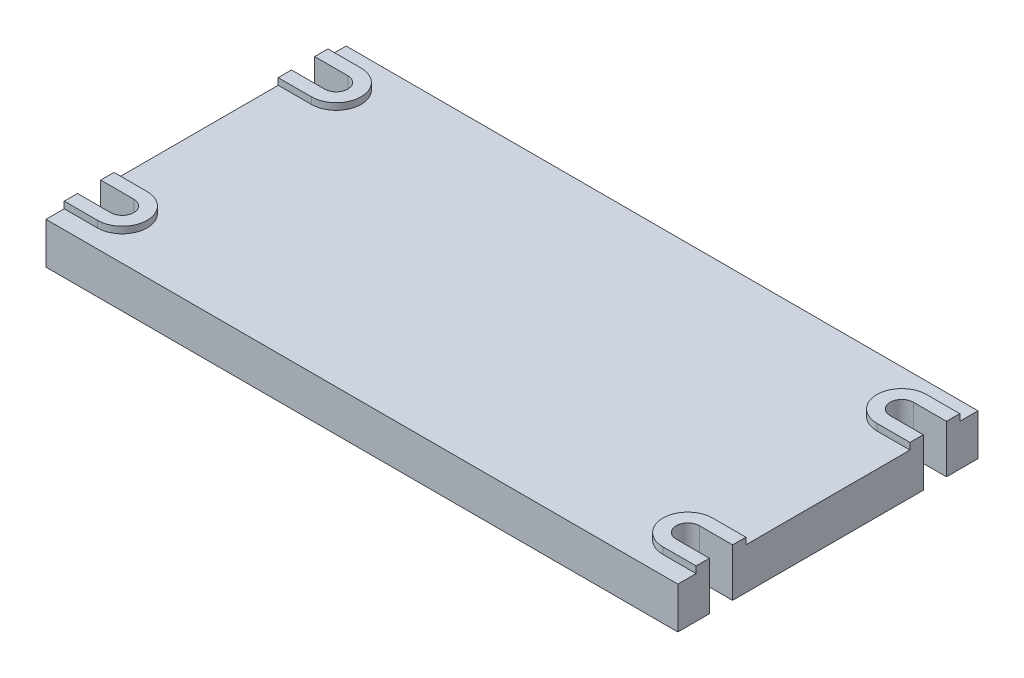
ISO-10303-21;
HEADER;
FILE_DESCRIPTION(('STEP AP214'),'2;1');
FILE_NAME('part.step','',(''),(''),'','','');
FILE_SCHEMA(('AUTOMOTIVE_DESIGN { 1 0 10303 214 1 1 1 1 }'));
ENDSEC;
DATA;
#1=APPLICATION_CONTEXT('core data for automotive mechanical design processes');
#2=APPLICATION_PROTOCOL_DEFINITION('international standard','automotive_design',2000,#1);
#3=PRODUCT_CONTEXT('',#1,'mechanical');
#4=PRODUCT('Part','Part','',(#3));
#5=PRODUCT_RELATED_PRODUCT_CATEGORY('part','',(#4));
#6=PRODUCT_DEFINITION_FORMATION('','',#4);
#7=PRODUCT_DEFINITION_CONTEXT('part definition',#1,'design');
#8=PRODUCT_DEFINITION('design','',#6,#7);
#9=PRODUCT_DEFINITION_SHAPE('','',#8);
#10=(LENGTH_UNIT() NAMED_UNIT(*) SI_UNIT(.MILLI.,.METRE.));
#11=(NAMED_UNIT(*) PLANE_ANGLE_UNIT() SI_UNIT($,.RADIAN.));
#12=(NAMED_UNIT(*) SI_UNIT($,.STERADIAN.) SOLID_ANGLE_UNIT());
#13=UNCERTAINTY_MEASURE_WITH_UNIT(LENGTH_MEASURE(1.E-05),#10,'distance_accuracy_value','');
#14=(GEOMETRIC_REPRESENTATION_CONTEXT(3) GLOBAL_UNCERTAINTY_ASSIGNED_CONTEXT((#13)) GLOBAL_UNIT_ASSIGNED_CONTEXT((#10,
#11,#12)) REPRESENTATION_CONTEXT('',''));
#15=CARTESIAN_POINT('',(0.,0.,0.));
#16=DIRECTION('',(0.,0.,1.));
#17=DIRECTION('',(1.,0.,0.));
#18=AXIS2_PLACEMENT_3D('',#15,#16,#17);
#19=CARTESIAN_POINT('',(190.5,25.,90.5));
#20=DIRECTION('',(-1.,0.,0.));
#21=DIRECTION('',(0.,0.,1.));
#22=AXIS2_PLACEMENT_3D('',#19,#20,#21);
#23=PLANE('',#22);
#24=DIRECTION('',(0.,1.,0.));
#25=VECTOR('',#24,1.);
#26=CARTESIAN_POINT('',(190.5,0.,-71.5));
#27=LINE('',#26,#25);
#28=CARTESIAN_POINT('',(190.5,0.,-71.5));
#29=VERTEX_POINT('',#28);
#30=CARTESIAN_POINT('',(190.5,29.,-71.5));
#31=VERTEX_POINT('',#30);
#32=EDGE_CURVE('E280',#29,#31,#27,.T.);
#33=ORIENTED_EDGE('',*,*,#32,.F.);
#34=DIRECTION('',(0.,0.,-1.));
#35=VECTOR('',#34,1.);
#36=CARTESIAN_POINT('',(190.5,0.,90.5));
#37=LINE('',#36,#35);
#38=CARTESIAN_POINT('',(190.5,0.,-90.5));
#39=VERTEX_POINT('',#38);
#40=EDGE_CURVE('E503',#29,#39,#37,.T.);
#41=ORIENTED_EDGE('',*,*,#40,.T.);
#42=DIRECTION('',(0.,-1.,0.));
#43=VECTOR('',#42,1.);
#44=CARTESIAN_POINT('',(190.5,25.,-90.5));
#45=LINE('',#44,#43);
#46=CARTESIAN_POINT('',(190.5,25.,-90.5));
#47=VERTEX_POINT('',#46);
#48=EDGE_CURVE('E11',#47,#39,#45,.T.);
#49=ORIENTED_EDGE('',*,*,#48,.F.);
#50=DIRECTION('',(0.,0.,-1.));
#51=VECTOR('',#50,1.);
#52=CARTESIAN_POINT('',(190.5,25.,90.5));
#53=LINE('',#52,#51);
#54=CARTESIAN_POINT('',(190.5,25.,-79.5));
#55=VERTEX_POINT('',#54);
#56=EDGE_CURVE('E514',#55,#47,#53,.T.);
#57=ORIENTED_EDGE('',*,*,#56,.F.);
#58=DIRECTION('',(0.,-1.,0.));
#59=VECTOR('',#58,1.);
#60=CARTESIAN_POINT('',(190.5,29.,-79.5));
#61=LINE('',#60,#59);
#62=CARTESIAN_POINT('',(190.5,29.,-79.5));
#63=VERTEX_POINT('',#62);
#64=EDGE_CURVE('E320',#63,#55,#61,.T.);
#65=ORIENTED_EDGE('',*,*,#64,.F.);
#66=DIRECTION('',(0.,0.,1.));
#67=VECTOR('',#66,1.);
#68=CARTESIAN_POINT('',(190.5,29.,0.));
#69=LINE('',#68,#67);
#70=EDGE_CURVE('E289',#63,#31,#69,.T.);
#71=ORIENTED_EDGE('',*,*,#70,.T.);
#72=EDGE_LOOP('',(#33,#41,#49,#57,#65,#71));
#73=FACE_BOUND('',#72,.T.);
#74=ADVANCED_FACE('F34',(#73),#23,.F.);
#75=CARTESIAN_POINT('',(0.,25.,0.));
#76=DIRECTION('',(0.,-1.,0.));
#77=DIRECTION('',(0.,0.,-1.));
#78=AXIS2_PLACEMENT_3D('',#75,#76,#77);
#79=PLANE('',#78);
#80=CARTESIAN_POINT('',(170.5,25.,-64.5));
#81=DIRECTION('',(0.,-1.,0.));
#82=DIRECTION('',(0.,0.,1.));
#83=AXIS2_PLACEMENT_3D('',#80,#81,#82);
#84=CIRCLE('',#83,15.);
#85=CARTESIAN_POINT('',(170.5,25.,-49.5));
#86=VERTEX_POINT('',#85);
#87=CARTESIAN_POINT('',(170.5,25.,-79.5));
#88=VERTEX_POINT('',#87);
#89=EDGE_CURVE('E52',#86,#88,#84,.T.);
#90=ORIENTED_EDGE('',*,*,#89,.T.);
#91=DIRECTION('',(1.,0.,0.));
#92=VECTOR('',#91,1.);
#93=CARTESIAN_POINT('',(0.,25.,-79.5));
#94=LINE('',#93,#92);
#95=EDGE_CURVE('E311',#88,#55,#94,.T.);
#96=ORIENTED_EDGE('',*,*,#95,.T.);
#97=ORIENTED_EDGE('',*,*,#56,.T.);
#98=DIRECTION('',(-1.,0.,0.));
#99=VECTOR('',#98,1.);
#100=CARTESIAN_POINT('',(-190.5,25.,-90.5));
#101=LINE('',#100,#99);
#102=CARTESIAN_POINT('',(-190.5,25.,-90.5));
#103=VERTEX_POINT('',#102);
#104=EDGE_CURVE('E512',#47,#103,#101,.T.);
#105=ORIENTED_EDGE('',*,*,#104,.T.);
#106=DIRECTION('',(0.,0.,1.));
#107=VECTOR('',#106,1.);
#108=CARTESIAN_POINT('',(-190.5,25.,90.5));
#109=LINE('',#108,#107);
#110=CARTESIAN_POINT('',(-190.5,25.,-79.5));
#111=VERTEX_POINT('',#110);
#112=EDGE_CURVE('E524',#103,#111,#109,.T.);
#113=ORIENTED_EDGE('',*,*,#112,.T.);
#114=DIRECTION('',(-1.,0.,0.));
#115=VECTOR('',#114,1.);
#116=CARTESIAN_POINT('',(0.,25.,-79.5));
#117=LINE('',#116,#115);
#118=CARTESIAN_POINT('',(-170.5,25.,-79.5));
#119=VERTEX_POINT('',#118);
#120=EDGE_CURVE('E445',#119,#111,#117,.T.);
#121=ORIENTED_EDGE('',*,*,#120,.F.);
#122=CARTESIAN_POINT('',(-170.5,25.,-64.5));
#123=DIRECTION('',(0.,1.,0.));
#124=DIRECTION('',(0.,0.,1.));
#125=AXIS2_PLACEMENT_3D('',#122,#123,#124);
#126=CIRCLE('',#125,15.);
#127=CARTESIAN_POINT('',(-170.5,25.,-49.5));
#128=VERTEX_POINT('',#127);
#129=EDGE_CURVE('E461',#128,#119,#126,.T.);
#130=ORIENTED_EDGE('',*,*,#129,.F.);
#131=DIRECTION('',(1.,0.,0.));
#132=VECTOR('',#131,1.);
#133=CARTESIAN_POINT('',(0.,25.,-49.5));
#134=LINE('',#133,#132);
#135=CARTESIAN_POINT('',(-190.5,25.,-49.5));
#136=VERTEX_POINT('',#135);
#137=EDGE_CURVE('E435',#136,#128,#134,.T.);
#138=ORIENTED_EDGE('',*,*,#137,.F.);
#139=CARTESIAN_POINT('',(-190.5,25.,49.5));
#140=VERTEX_POINT('',#139);
#141=EDGE_CURVE('E522',#136,#140,#109,.T.);
#142=ORIENTED_EDGE('',*,*,#141,.T.);
#143=DIRECTION('',(1.,0.,0.));
#144=VECTOR('',#143,1.);
#145=CARTESIAN_POINT('',(0.,25.,49.5));
#146=LINE('',#145,#144);
#147=CARTESIAN_POINT('',(-170.5,25.,49.5));
#148=VERTEX_POINT('',#147);
#149=EDGE_CURVE('E389',#140,#148,#146,.T.);
#150=ORIENTED_EDGE('',*,*,#149,.T.);
#151=CARTESIAN_POINT('',(-170.5,25.,64.5));
#152=DIRECTION('',(0.,-1.,0.));
#153=DIRECTION('',(0.,0.,-1.));
#154=AXIS2_PLACEMENT_3D('',#151,#152,#153);
#155=CIRCLE('',#154,15.);
#156=CARTESIAN_POINT('',(-170.5,25.,79.5));
#157=VERTEX_POINT('',#156);
#158=EDGE_CURVE('E410',#148,#157,#155,.T.);
#159=ORIENTED_EDGE('',*,*,#158,.T.);
#160=DIRECTION('',(-1.,0.,0.));
#161=VECTOR('',#160,1.);
#162=CARTESIAN_POINT('',(0.,25.,79.5));
#163=LINE('',#162,#161);
#164=CARTESIAN_POINT('',(-190.5,25.,79.5));
#165=VERTEX_POINT('',#164);
#166=EDGE_CURVE('E379',#157,#165,#163,.T.);
#167=ORIENTED_EDGE('',*,*,#166,.T.);
#168=CARTESIAN_POINT('',(-190.5,25.,90.5));
#169=VERTEX_POINT('',#168);
#170=EDGE_CURVE('E38',#165,#169,#109,.T.);
#171=ORIENTED_EDGE('',*,*,#170,.T.);
#172=DIRECTION('',(1.,0.,0.));
#173=VECTOR('',#172,1.);
#174=CARTESIAN_POINT('',(-190.5,25.,90.5));
#175=LINE('',#174,#173);
#176=CARTESIAN_POINT('',(190.5,25.,90.5));
#177=VERTEX_POINT('',#176);
#178=EDGE_CURVE('E517',#169,#177,#175,.T.);
#179=ORIENTED_EDGE('',*,*,#178,.T.);
#180=CARTESIAN_POINT('',(190.5,25.,79.5));
#181=VERTEX_POINT('',#180);
#182=EDGE_CURVE('E509',#177,#181,#53,.T.);
#183=ORIENTED_EDGE('',*,*,#182,.T.);
#184=DIRECTION('',(1.,0.,0.));
#185=VECTOR('',#184,1.);
#186=CARTESIAN_POINT('',(0.,25.,79.5));
#187=LINE('',#186,#185);
#188=CARTESIAN_POINT('',(170.5,25.,79.5));
#189=VERTEX_POINT('',#188);
#190=EDGE_CURVE('E338',#189,#181,#187,.T.);
#191=ORIENTED_EDGE('',*,*,#190,.F.);
#192=CARTESIAN_POINT('',(170.5,25.,64.5));
#193=DIRECTION('',(0.,1.,0.));
#194=DIRECTION('',(0.,0.,-1.));
#195=AXIS2_PLACEMENT_3D('',#192,#193,#194);
#196=CIRCLE('',#195,15.);
#197=CARTESIAN_POINT('',(170.5,25.,49.5));
#198=VERTEX_POINT('',#197);
#199=EDGE_CURVE('E355',#198,#189,#196,.T.);
#200=ORIENTED_EDGE('',*,*,#199,.F.);
#201=DIRECTION('',(-1.,0.,0.));
#202=VECTOR('',#201,1.);
#203=CARTESIAN_POINT('',(0.,25.,49.5));
#204=LINE('',#203,#202);
#205=CARTESIAN_POINT('',(190.5,25.,49.5));
#206=VERTEX_POINT('',#205);
#207=EDGE_CURVE('E330',#206,#198,#204,.T.);
#208=ORIENTED_EDGE('',*,*,#207,.F.);
#209=CARTESIAN_POINT('',(190.5,25.,-49.5));
#210=VERTEX_POINT('',#209);
#211=EDGE_CURVE('E513',#206,#210,#53,.T.);
#212=ORIENTED_EDGE('',*,*,#211,.T.);
#213=DIRECTION('',(-1.,0.,0.));
#214=VECTOR('',#213,1.);
#215=CARTESIAN_POINT('',(0.,25.,-49.5));
#216=LINE('',#215,#214);
#217=EDGE_CURVE('E57',#210,#86,#216,.T.);
#218=ORIENTED_EDGE('',*,*,#217,.T.);
#219=EDGE_LOOP('',(#90,#96,#97,#105,#113,#121,#130,#138,#142,#150,#159,#167,#171,#179,#183,#191,
#200,#208,#212,#218));
#220=FACE_BOUND('',#219,.T.);
#221=ADVANCED_FACE('F534',(#220),#79,.F.);
#222=CARTESIAN_POINT('',(0.,0.,0.));
#223=DIRECTION('',(0.,-1.,0.));
#224=DIRECTION('',(0.,0.,-1.));
#225=AXIS2_PLACEMENT_3D('',#222,#223,#224);
#226=PLANE('',#225);
#227=DIRECTION('',(1.,0.,0.));
#228=VECTOR('',#227,1.);
#229=CARTESIAN_POINT('',(0.,0.,-57.5));
#230=LINE('',#229,#228);
#231=CARTESIAN_POINT('',(170.5,0.,-57.5));
#232=VERTEX_POINT('',#231);
#233=CARTESIAN_POINT('',(190.5,0.,-57.5));
#234=VERTEX_POINT('',#233);
#235=EDGE_CURVE('E323',#232,#234,#230,.T.);
#236=ORIENTED_EDGE('',*,*,#235,.T.);
#237=CARTESIAN_POINT('',(190.5,0.,57.5));
#238=VERTEX_POINT('',#237);
#239=EDGE_CURVE('E584',#238,#234,#37,.T.);
#240=ORIENTED_EDGE('',*,*,#239,.F.);
#241=DIRECTION('',(1.,0.,0.));
#242=VECTOR('',#241,1.);
#243=CARTESIAN_POINT('',(0.,0.,57.5));
#244=LINE('',#243,#242);
#245=CARTESIAN_POINT('',(170.5,0.,57.5));
#246=VERTEX_POINT('',#245);
#247=EDGE_CURVE('E368',#246,#238,#244,.T.);
#248=ORIENTED_EDGE('',*,*,#247,.F.);
#249=CARTESIAN_POINT('',(170.5,0.,64.5));
#250=DIRECTION('',(0.,1.,0.));
#251=DIRECTION('',(0.,0.,-1.));
#252=AXIS2_PLACEMENT_3D('',#249,#250,#251);
#253=CIRCLE('',#252,7.);
#254=CARTESIAN_POINT('',(170.5,0.,71.5));
#255=VERTEX_POINT('',#254);
#256=EDGE_CURVE('E370',#246,#255,#253,.T.);
#257=ORIENTED_EDGE('',*,*,#256,.T.);
#258=DIRECTION('',(1.,0.,0.));
#259=VECTOR('',#258,1.);
#260=CARTESIAN_POINT('',(0.,0.,71.5));
#261=LINE('',#260,#259);
#262=CARTESIAN_POINT('',(190.5,0.,71.5));
#263=VERTEX_POINT('',#262);
#264=EDGE_CURVE('E373',#255,#263,#261,.T.);
#265=ORIENTED_EDGE('',*,*,#264,.T.);
#266=CARTESIAN_POINT('',(190.5,0.,90.5));
#267=VERTEX_POINT('',#266);
#268=EDGE_CURVE('E583',#267,#263,#37,.T.);
#269=ORIENTED_EDGE('',*,*,#268,.F.);
#270=DIRECTION('',(1.,0.,0.));
#271=VECTOR('',#270,1.);
#272=CARTESIAN_POINT('',(-190.5,0.,90.5));
#273=LINE('',#272,#271);
#274=CARTESIAN_POINT('',(-190.5,0.,90.5));
#275=VERTEX_POINT('',#274);
#276=EDGE_CURVE('E565',#275,#267,#273,.T.);
#277=ORIENTED_EDGE('',*,*,#276,.F.);
#278=DIRECTION('',(0.,0.,1.));
#279=VECTOR('',#278,1.);
#280=CARTESIAN_POINT('',(-190.5,0.,90.5));
#281=LINE('',#280,#279);
#282=CARTESIAN_POINT('',(-190.5,0.,71.5));
#283=VERTEX_POINT('',#282);
#284=EDGE_CURVE('E552',#283,#275,#281,.T.);
#285=ORIENTED_EDGE('',*,*,#284,.F.);
#286=DIRECTION('',(-1.,0.,0.));
#287=VECTOR('',#286,1.);
#288=CARTESIAN_POINT('',(0.,0.,71.5));
#289=LINE('',#288,#287);
#290=CARTESIAN_POINT('',(-170.5,0.,71.5));
#291=VERTEX_POINT('',#290);
#292=EDGE_CURVE('E427',#291,#283,#289,.T.);
#293=ORIENTED_EDGE('',*,*,#292,.F.);
#294=CARTESIAN_POINT('',(-170.5,0.,64.5));
#295=DIRECTION('',(0.,-1.,0.));
#296=DIRECTION('',(0.,0.,-1.));
#297=AXIS2_PLACEMENT_3D('',#294,#295,#296);
#298=CIRCLE('',#297,7.);
#299=CARTESIAN_POINT('',(-170.5,0.,57.5));
#300=VERTEX_POINT('',#299);
#301=EDGE_CURVE('E429',#300,#291,#298,.T.);
#302=ORIENTED_EDGE('',*,*,#301,.F.);
#303=DIRECTION('',(-1.,0.,0.));
#304=VECTOR('',#303,1.);
#305=CARTESIAN_POINT('',(0.,0.,57.5));
#306=LINE('',#305,#304);
#307=CARTESIAN_POINT('',(-190.5,0.,57.5));
#308=VERTEX_POINT('',#307);
#309=EDGE_CURVE('E424',#300,#308,#306,.T.);
#310=ORIENTED_EDGE('',*,*,#309,.T.);
#311=CARTESIAN_POINT('',(-190.5,0.,-57.5));
#312=VERTEX_POINT('',#311);
#313=EDGE_CURVE('E581',#312,#308,#281,.T.);
#314=ORIENTED_EDGE('',*,*,#313,.F.);
#315=DIRECTION('',(-1.,0.,0.));
#316=VECTOR('',#315,1.);
#317=CARTESIAN_POINT('',(0.,0.,-57.5));
#318=LINE('',#317,#316);
#319=CARTESIAN_POINT('',(-170.5,0.,-57.5));
#320=VERTEX_POINT('',#319);
#321=EDGE_CURVE('E491',#320,#312,#318,.T.);
#322=ORIENTED_EDGE('',*,*,#321,.F.);
#323=CARTESIAN_POINT('',(-170.5,0.,-64.5));
#324=DIRECTION('',(0.,1.,0.));
#325=DIRECTION('',(0.,0.,1.));
#326=AXIS2_PLACEMENT_3D('',#323,#324,#325);
#327=CIRCLE('',#326,7.);
#328=CARTESIAN_POINT('',(-170.5,0.,-71.5));
#329=VERTEX_POINT('',#328);
#330=EDGE_CURVE('E494',#320,#329,#327,.T.);
#331=ORIENTED_EDGE('',*,*,#330,.T.);
#332=DIRECTION('',(-1.,0.,0.));
#333=VECTOR('',#332,1.);
#334=CARTESIAN_POINT('',(0.,0.,-71.5));
#335=LINE('',#334,#333);
#336=CARTESIAN_POINT('',(-190.5,0.,-71.5));
#337=VERTEX_POINT('',#336);
#338=EDGE_CURVE('E497',#329,#337,#335,.T.);
#339=ORIENTED_EDGE('',*,*,#338,.T.);
#340=CARTESIAN_POINT('',(-190.5,0.,-90.5));
#341=VERTEX_POINT('',#340);
#342=EDGE_CURVE('E573',#341,#337,#281,.T.);
#343=ORIENTED_EDGE('',*,*,#342,.F.);
#344=DIRECTION('',(-1.,0.,0.));
#345=VECTOR('',#344,1.);
#346=CARTESIAN_POINT('',(-190.5,0.,-90.5));
#347=LINE('',#346,#345);
#348=EDGE_CURVE('E580',#39,#341,#347,.T.);
#349=ORIENTED_EDGE('',*,*,#348,.F.);
#350=ORIENTED_EDGE('',*,*,#40,.F.);
#351=DIRECTION('',(1.,0.,0.));
#352=VECTOR('',#351,1.);
#353=CARTESIAN_POINT('',(0.,0.,-71.5));
#354=LINE('',#353,#352);
#355=CARTESIAN_POINT('',(170.5,0.,-71.5));
#356=VERTEX_POINT('',#355);
#357=EDGE_CURVE('E326',#356,#29,#354,.T.);
#358=ORIENTED_EDGE('',*,*,#357,.F.);
#359=CARTESIAN_POINT('',(170.5,0.,-64.5));
#360=DIRECTION('',(0.,-1.,0.));
#361=DIRECTION('',(0.,0.,1.));
#362=AXIS2_PLACEMENT_3D('',#359,#360,#361);
#363=CIRCLE('',#362,7.);
#364=EDGE_CURVE('E276',#232,#356,#363,.T.);
#365=ORIENTED_EDGE('',*,*,#364,.F.);
#366=EDGE_LOOP('',(#236,#240,#248,#257,#265,#269,#277,#285,#293,#302,#310,#314,#322,#331,#339,
#343,#349,#350,#358,#365));
#367=FACE_BOUND('',#366,.T.);
#368=ADVANCED_FACE('F578',(#367),#226,.T.);
#369=ORIENTED_EDGE('',*,*,#239,.T.);
#370=DIRECTION('',(0.,1.,0.));
#371=VECTOR('',#370,1.);
#372=CARTESIAN_POINT('',(190.5,0.,-57.5));
#373=LINE('',#372,#371);
#374=CARTESIAN_POINT('',(190.5,29.,-57.5));
#375=VERTEX_POINT('',#374);
#376=EDGE_CURVE('E329',#234,#375,#373,.T.);
#377=ORIENTED_EDGE('',*,*,#376,.T.);
#378=CARTESIAN_POINT('',(190.5,29.,-49.5));
#379=VERTEX_POINT('',#378);
#380=EDGE_CURVE('E300',#375,#379,#69,.T.);
#381=ORIENTED_EDGE('',*,*,#380,.T.);
#382=DIRECTION('',(0.,-1.,0.));
#383=VECTOR('',#382,1.);
#384=CARTESIAN_POINT('',(190.5,29.,-49.5));
#385=LINE('',#384,#383);
#386=EDGE_CURVE('E310',#379,#210,#385,.T.);
#387=ORIENTED_EDGE('',*,*,#386,.T.);
#388=ORIENTED_EDGE('',*,*,#211,.F.);
#389=DIRECTION('',(0.,-1.,0.));
#390=VECTOR('',#389,1.);
#391=CARTESIAN_POINT('',(190.5,29.,49.5));
#392=LINE('',#391,#390);
#393=CARTESIAN_POINT('',(190.5,29.,49.5));
#394=VERTEX_POINT('',#393);
#395=EDGE_CURVE('E366',#394,#206,#392,.T.);
#396=ORIENTED_EDGE('',*,*,#395,.F.);
#397=DIRECTION('',(0.,0.,-1.));
#398=VECTOR('',#397,1.);
#399=CARTESIAN_POINT('',(190.5,29.,0.));
#400=LINE('',#399,#398);
#401=CARTESIAN_POINT('',(190.5,29.,57.5));
#402=VERTEX_POINT('',#401);
#403=EDGE_CURVE('E341',#402,#394,#400,.T.);
#404=ORIENTED_EDGE('',*,*,#403,.F.);
#405=DIRECTION('',(0.,1.,0.));
#406=VECTOR('',#405,1.);
#407=CARTESIAN_POINT('',(190.5,0.,57.5));
#408=LINE('',#407,#406);
#409=EDGE_CURVE('E377',#238,#402,#408,.T.);
#410=ORIENTED_EDGE('',*,*,#409,.F.);
#411=EDGE_LOOP('',(#369,#377,#381,#387,#388,#396,#404,#410));
#412=FACE_BOUND('',#411,.T.);
#413=ADVANCED_FACE('F595',(#412),#23,.F.);
#414=CARTESIAN_POINT('',(-190.5,25.,90.5));
#415=DIRECTION('',(1.,0.,0.));
#416=DIRECTION('',(0.,0.,-1.));
#417=AXIS2_PLACEMENT_3D('',#414,#415,#416);
#418=PLANE('',#417);
#419=DIRECTION('',(0.,1.,0.));
#420=VECTOR('',#419,1.);
#421=CARTESIAN_POINT('',(-190.5,0.,71.5));
#422=LINE('',#421,#420);
#423=CARTESIAN_POINT('',(-190.5,29.,71.5));
#424=VERTEX_POINT('',#423);
#425=EDGE_CURVE('E438',#283,#424,#422,.T.);
#426=ORIENTED_EDGE('',*,*,#425,.F.);
#427=ORIENTED_EDGE('',*,*,#284,.T.);
#428=DIRECTION('',(0.,-1.,0.));
#429=VECTOR('',#428,1.);
#430=CARTESIAN_POINT('',(-190.5,25.,90.5));
#431=LINE('',#430,#429);
#432=EDGE_CURVE('E548',#169,#275,#431,.T.);
#433=ORIENTED_EDGE('',*,*,#432,.F.);
#434=ORIENTED_EDGE('',*,*,#170,.F.);
#435=DIRECTION('',(0.,-1.,0.));
#436=VECTOR('',#435,1.);
#437=CARTESIAN_POINT('',(-190.5,29.,79.5));
#438=LINE('',#437,#436);
#439=CARTESIAN_POINT('',(-190.5,29.,79.5));
#440=VERTEX_POINT('',#439);
#441=EDGE_CURVE('E421',#440,#165,#438,.T.);
#442=ORIENTED_EDGE('',*,*,#441,.F.);
#443=DIRECTION('',(0.,0.,-1.));
#444=VECTOR('',#443,1.);
#445=CARTESIAN_POINT('',(-190.5,29.,0.));
#446=LINE('',#445,#444);
#447=EDGE_CURVE('E392',#440,#424,#446,.T.);
#448=ORIENTED_EDGE('',*,*,#447,.T.);
#449=EDGE_LOOP('',(#426,#427,#433,#434,#442,#448));
#450=FACE_BOUND('',#449,.T.);
#451=ADVANCED_FACE('F550',(#450),#418,.F.);
#452=ORIENTED_EDGE('',*,*,#313,.T.);
#453=DIRECTION('',(0.,1.,0.));
#454=VECTOR('',#453,1.);
#455=CARTESIAN_POINT('',(-190.5,0.,57.5));
#456=LINE('',#455,#454);
#457=CARTESIAN_POINT('',(-190.5,29.,57.5));
#458=VERTEX_POINT('',#457);
#459=EDGE_CURVE('E432',#308,#458,#456,.T.);
#460=ORIENTED_EDGE('',*,*,#459,.T.);
#461=CARTESIAN_POINT('',(-190.5,29.,49.5));
#462=VERTEX_POINT('',#461);
#463=EDGE_CURVE('E396',#458,#462,#446,.T.);
#464=ORIENTED_EDGE('',*,*,#463,.T.);
#465=DIRECTION('',(0.,-1.,0.));
#466=VECTOR('',#465,1.);
#467=CARTESIAN_POINT('',(-190.5,29.,49.5));
#468=LINE('',#467,#466);
#469=EDGE_CURVE('E408',#462,#140,#468,.T.);
#470=ORIENTED_EDGE('',*,*,#469,.T.);
#471=ORIENTED_EDGE('',*,*,#141,.F.);
#472=DIRECTION('',(0.,-1.,0.));
#473=VECTOR('',#472,1.);
#474=CARTESIAN_POINT('',(-190.5,29.,-49.5));
#475=LINE('',#474,#473);
#476=CARTESIAN_POINT('',(-190.5,29.,-49.5));
#477=VERTEX_POINT('',#476);
#478=EDGE_CURVE('E486',#477,#136,#475,.T.);
#479=ORIENTED_EDGE('',*,*,#478,.F.);
#480=DIRECTION('',(0.,0.,1.));
#481=VECTOR('',#480,1.);
#482=CARTESIAN_POINT('',(-190.5,29.,0.));
#483=LINE('',#482,#481);
#484=CARTESIAN_POINT('',(-190.5,29.,-57.5));
#485=VERTEX_POINT('',#484);
#486=EDGE_CURVE('E448',#485,#477,#483,.T.);
#487=ORIENTED_EDGE('',*,*,#486,.F.);
#488=DIRECTION('',(0.,1.,0.));
#489=VECTOR('',#488,1.);
#490=CARTESIAN_POINT('',(-190.5,0.,-57.5));
#491=LINE('',#490,#489);
#492=EDGE_CURVE('E501',#312,#485,#491,.T.);
#493=ORIENTED_EDGE('',*,*,#492,.F.);
#494=EDGE_LOOP('',(#452,#460,#464,#470,#471,#479,#487,#493));
#495=FACE_BOUND('',#494,.T.);
#496=ADVANCED_FACE('F537',(#495),#418,.F.);
#497=ORIENTED_EDGE('',*,*,#268,.T.);
#498=DIRECTION('',(0.,1.,0.));
#499=VECTOR('',#498,1.);
#500=CARTESIAN_POINT('',(190.5,0.,71.5));
#501=LINE('',#500,#499);
#502=CARTESIAN_POINT('',(190.5,29.,71.5));
#503=VERTEX_POINT('',#502);
#504=EDGE_CURVE('E380',#263,#503,#501,.T.);
#505=ORIENTED_EDGE('',*,*,#504,.T.);
#506=CARTESIAN_POINT('',(190.5,29.,79.5));
#507=VERTEX_POINT('',#506);
#508=EDGE_CURVE('E344',#507,#503,#400,.T.);
#509=ORIENTED_EDGE('',*,*,#508,.F.);
#510=DIRECTION('',(0.,-1.,0.));
#511=VECTOR('',#510,1.);
#512=CARTESIAN_POINT('',(190.5,29.,79.5));
#513=LINE('',#512,#511);
#514=EDGE_CURVE('E353',#507,#181,#513,.T.);
#515=ORIENTED_EDGE('',*,*,#514,.T.);
#516=ORIENTED_EDGE('',*,*,#182,.F.);
#517=DIRECTION('',(0.,-1.,0.));
#518=VECTOR('',#517,1.);
#519=CARTESIAN_POINT('',(190.5,25.,90.5));
#520=LINE('',#519,#518);
#521=EDGE_CURVE('E555',#177,#267,#520,.T.);
#522=ORIENTED_EDGE('',*,*,#521,.T.);
#523=EDGE_LOOP('',(#497,#505,#509,#515,#516,#522));
#524=FACE_BOUND('',#523,.T.);
#525=ADVANCED_FACE('F36',(#524),#23,.F.);
#526=CARTESIAN_POINT('',(-190.5,25.,-90.5));
#527=DIRECTION('',(0.,0.,1.));
#528=DIRECTION('',(1.,0.,0.));
#529=AXIS2_PLACEMENT_3D('',#526,#527,#528);
#530=PLANE('',#529);
#531=ORIENTED_EDGE('',*,*,#348,.T.);
#532=DIRECTION('',(0.,-1.,0.));
#533=VECTOR('',#532,1.);
#534=CARTESIAN_POINT('',(-190.5,25.,-90.5));
#535=LINE('',#534,#533);
#536=EDGE_CURVE('E44',#103,#341,#535,.T.);
#537=ORIENTED_EDGE('',*,*,#536,.F.);
#538=ORIENTED_EDGE('',*,*,#104,.F.);
#539=ORIENTED_EDGE('',*,*,#48,.T.);
#540=EDGE_LOOP('',(#531,#537,#538,#539));
#541=FACE_BOUND('',#540,.T.);
#542=ADVANCED_FACE('F631',(#541),#530,.F.);
#543=ORIENTED_EDGE('',*,*,#342,.T.);
#544=DIRECTION('',(0.,1.,0.));
#545=VECTOR('',#544,1.);
#546=CARTESIAN_POINT('',(-190.5,0.,-71.5));
#547=LINE('',#546,#545);
#548=CARTESIAN_POINT('',(-190.5,29.,-71.5));
#549=VERTEX_POINT('',#548);
#550=EDGE_CURVE('E504',#337,#549,#547,.T.);
#551=ORIENTED_EDGE('',*,*,#550,.T.);
#552=CARTESIAN_POINT('',(-190.5,29.,-79.5));
#553=VERTEX_POINT('',#552);
#554=EDGE_CURVE('E451',#553,#549,#483,.T.);
#555=ORIENTED_EDGE('',*,*,#554,.F.);
#556=DIRECTION('',(0.,-1.,0.));
#557=VECTOR('',#556,1.);
#558=CARTESIAN_POINT('',(-190.5,29.,-79.5));
#559=LINE('',#558,#557);
#560=EDGE_CURVE('E460',#553,#111,#559,.T.);
#561=ORIENTED_EDGE('',*,*,#560,.T.);
#562=ORIENTED_EDGE('',*,*,#112,.F.);
#563=ORIENTED_EDGE('',*,*,#536,.T.);
#564=EDGE_LOOP('',(#543,#551,#555,#561,#562,#563));
#565=FACE_BOUND('',#564,.T.);
#566=ADVANCED_FACE('F572',(#565),#418,.F.);
#567=CARTESIAN_POINT('',(-190.5,25.,90.5));
#568=DIRECTION('',(0.,0.,-1.));
#569=DIRECTION('',(-1.,0.,0.));
#570=AXIS2_PLACEMENT_3D('',#567,#568,#569);
#571=PLANE('',#570);
#572=ORIENTED_EDGE('',*,*,#276,.T.);
#573=ORIENTED_EDGE('',*,*,#521,.F.);
#574=ORIENTED_EDGE('',*,*,#178,.F.);
#575=ORIENTED_EDGE('',*,*,#432,.T.);
#576=EDGE_LOOP('',(#572,#573,#574,#575));
#577=FACE_BOUND('',#576,.T.);
#578=ADVANCED_FACE('F557',(#577),#571,.F.);
#579=CARTESIAN_POINT('',(0.,0.,-57.5));
#580=DIRECTION('',(0.,0.,-1.));
#581=DIRECTION('',(-1.,0.,0.));
#582=AXIS2_PLACEMENT_3D('',#579,#580,#581);
#583=PLANE('',#582);
#584=ORIENTED_EDGE('',*,*,#492,.T.);
#585=DIRECTION('',(-1.,0.,0.));
#586=VECTOR('',#585,1.);
#587=CARTESIAN_POINT('',(0.,29.,-57.5));
#588=LINE('',#587,#586);
#589=CARTESIAN_POINT('',(-170.5,29.,-57.5));
#590=VERTEX_POINT('',#589);
#591=EDGE_CURVE('E444',#590,#485,#588,.T.);
#592=ORIENTED_EDGE('',*,*,#591,.F.);
#593=DIRECTION('',(0.,1.,0.));
#594=VECTOR('',#593,1.);
#595=CARTESIAN_POINT('',(-170.5,0.,-57.5));
#596=LINE('',#595,#594);
#597=EDGE_CURVE('E500',#320,#590,#596,.T.);
#598=ORIENTED_EDGE('',*,*,#597,.F.);
#599=ORIENTED_EDGE('',*,*,#321,.T.);
#600=EDGE_LOOP('',(#584,#592,#598,#599));
#601=FACE_BOUND('',#600,.T.);
#602=ADVANCED_FACE('F654',(#601),#583,.T.);
#603=CARTESIAN_POINT('',(0.,0.,-71.5));
#604=DIRECTION('',(0.,0.,-1.));
#605=DIRECTION('',(-1.,0.,0.));
#606=AXIS2_PLACEMENT_3D('',#603,#604,#605);
#607=PLANE('',#606);
#608=DIRECTION('',(0.,1.,0.));
#609=VECTOR('',#608,1.);
#610=CARTESIAN_POINT('',(-170.5,0.,-71.5));
#611=LINE('',#610,#609);
#612=CARTESIAN_POINT('',(-170.5,29.,-71.5));
#613=VERTEX_POINT('',#612);
#614=EDGE_CURVE('E506',#329,#613,#611,.T.);
#615=ORIENTED_EDGE('',*,*,#614,.T.);
#616=DIRECTION('',(-1.,0.,0.));
#617=VECTOR('',#616,1.);
#618=CARTESIAN_POINT('',(0.,29.,-71.5));
#619=LINE('',#618,#617);
#620=EDGE_CURVE('E457',#613,#549,#619,.T.);
#621=ORIENTED_EDGE('',*,*,#620,.T.);
#622=ORIENTED_EDGE('',*,*,#550,.F.);
#623=ORIENTED_EDGE('',*,*,#338,.F.);
#624=EDGE_LOOP('',(#615,#621,#622,#623));
#625=FACE_BOUND('',#624,.T.);
#626=ADVANCED_FACE('F658',(#625),#607,.F.);
#627=CARTESIAN_POINT('',(-170.5,0.,-64.5));
#628=DIRECTION('',(0.,1.,0.));
#629=DIRECTION('',(0.,0.,1.));
#630=AXIS2_PLACEMENT_3D('',#627,#628,#629);
#631=CYLINDRICAL_SURFACE('',#630,7.);
#632=ORIENTED_EDGE('',*,*,#597,.T.);
#633=CARTESIAN_POINT('',(-170.5,29.,-64.5));
#634=DIRECTION('',(0.,1.,0.));
#635=DIRECTION('',(0.,0.,1.));
#636=AXIS2_PLACEMENT_3D('',#633,#634,#635);
#637=CIRCLE('',#636,7.);
#638=EDGE_CURVE('E441',#590,#613,#637,.T.);
#639=ORIENTED_EDGE('',*,*,#638,.T.);
#640=ORIENTED_EDGE('',*,*,#614,.F.);
#641=ORIENTED_EDGE('',*,*,#330,.F.);
#642=EDGE_LOOP('',(#632,#639,#640,#641));
#643=FACE_BOUND('',#642,.T.);
#644=ADVANCED_FACE('F663',(#643),#631,.F.);
#645=CARTESIAN_POINT('',(0.,29.,-49.5));
#646=DIRECTION('',(0.,0.,-1.));
#647=DIRECTION('',(-1.,0.,0.));
#648=AXIS2_PLACEMENT_3D('',#645,#646,#647);
#649=PLANE('',#648);
#650=ORIENTED_EDGE('',*,*,#137,.T.);
#651=DIRECTION('',(0.,-1.,0.));
#652=VECTOR('',#651,1.);
#653=CARTESIAN_POINT('',(-170.5,29.,-49.5));
#654=LINE('',#653,#652);
#655=CARTESIAN_POINT('',(-170.5,29.,-49.5));
#656=VERTEX_POINT('',#655);
#657=EDGE_CURVE('E481',#656,#128,#654,.T.);
#658=ORIENTED_EDGE('',*,*,#657,.F.);
#659=DIRECTION('',(1.,0.,0.));
#660=VECTOR('',#659,1.);
#661=CARTESIAN_POINT('',(0.,29.,-49.5));
#662=LINE('',#661,#660);
#663=EDGE_CURVE('E450',#477,#656,#662,.T.);
#664=ORIENTED_EDGE('',*,*,#663,.F.);
#665=ORIENTED_EDGE('',*,*,#478,.T.);
#666=EDGE_LOOP('',(#650,#658,#664,#665));
#667=FACE_BOUND('',#666,.T.);
#668=ADVANCED_FACE('F530',(#667),#649,.F.);
#669=CARTESIAN_POINT('',(-170.5,29.,-64.5));
#670=DIRECTION('',(0.,-1.,0.));
#671=DIRECTION('',(0.,0.,-1.));
#672=AXIS2_PLACEMENT_3D('',#669,#670,#671);
#673=CYLINDRICAL_SURFACE('',#672,15.);
#674=ORIENTED_EDGE('',*,*,#129,.T.);
#675=DIRECTION('',(0.,-1.,0.));
#676=VECTOR('',#675,1.);
#677=CARTESIAN_POINT('',(-170.5,29.,-79.5));
#678=LINE('',#677,#676);
#679=CARTESIAN_POINT('',(-170.5,29.,-79.5));
#680=VERTEX_POINT('',#679);
#681=EDGE_CURVE('E466',#680,#119,#678,.T.);
#682=ORIENTED_EDGE('',*,*,#681,.F.);
#683=CARTESIAN_POINT('',(-170.5,29.,-64.5));
#684=DIRECTION('',(0.,1.,0.));
#685=DIRECTION('',(0.,0.,1.));
#686=AXIS2_PLACEMENT_3D('',#683,#684,#685);
#687=CIRCLE('',#686,15.);
#688=EDGE_CURVE('E453',#656,#680,#687,.T.);
#689=ORIENTED_EDGE('',*,*,#688,.F.);
#690=ORIENTED_EDGE('',*,*,#657,.T.);
#691=EDGE_LOOP('',(#674,#682,#689,#690));
#692=FACE_BOUND('',#691,.T.);
#693=ADVANCED_FACE('F672',(#692),#673,.T.);
#694=CARTESIAN_POINT('',(0.,29.,-79.5));
#695=DIRECTION('',(0.,0.,1.));
#696=DIRECTION('',(1.,0.,0.));
#697=AXIS2_PLACEMENT_3D('',#694,#695,#696);
#698=PLANE('',#697);
#699=ORIENTED_EDGE('',*,*,#120,.T.);
#700=ORIENTED_EDGE('',*,*,#560,.F.);
#701=DIRECTION('',(-1.,0.,0.));
#702=VECTOR('',#701,1.);
#703=CARTESIAN_POINT('',(0.,29.,-79.5));
#704=LINE('',#703,#702);
#705=EDGE_CURVE('E455',#680,#553,#704,.T.);
#706=ORIENTED_EDGE('',*,*,#705,.F.);
#707=ORIENTED_EDGE('',*,*,#681,.T.);
#708=EDGE_LOOP('',(#699,#700,#706,#707));
#709=FACE_BOUND('',#708,.T.);
#710=ADVANCED_FACE('F675',(#709),#698,.F.);
#711=CARTESIAN_POINT('',(0.,29.,0.));
#712=DIRECTION('',(0.,1.,0.));
#713=DIRECTION('',(0.,0.,1.));
#714=AXIS2_PLACEMENT_3D('',#711,#712,#713);
#715=PLANE('',#714);
#716=ORIENTED_EDGE('',*,*,#638,.F.);
#717=ORIENTED_EDGE('',*,*,#591,.T.);
#718=ORIENTED_EDGE('',*,*,#486,.T.);
#719=ORIENTED_EDGE('',*,*,#663,.T.);
#720=ORIENTED_EDGE('',*,*,#688,.T.);
#721=ORIENTED_EDGE('',*,*,#705,.T.);
#722=ORIENTED_EDGE('',*,*,#554,.T.);
#723=ORIENTED_EDGE('',*,*,#620,.F.);
#724=EDGE_LOOP('',(#716,#717,#718,#719,#720,#721,#722,#723));
#725=FACE_BOUND('',#724,.T.);
#726=ADVANCED_FACE('F678',(#725),#715,.T.);
#727=CARTESIAN_POINT('',(0.,0.,57.5));
#728=DIRECTION('',(0.,0.,-1.));
#729=DIRECTION('',(-1.,0.,0.));
#730=AXIS2_PLACEMENT_3D('',#727,#728,#729);
#731=PLANE('',#730);
#732=DIRECTION('',(0.,1.,0.));
#733=VECTOR('',#732,1.);
#734=CARTESIAN_POINT('',(-170.5,0.,57.5));
#735=LINE('',#734,#733);
#736=CARTESIAN_POINT('',(-170.5,29.,57.5));
#737=VERTEX_POINT('',#736);
#738=EDGE_CURVE('E433',#300,#737,#735,.T.);
#739=ORIENTED_EDGE('',*,*,#738,.T.);
#740=DIRECTION('',(-1.,0.,0.));
#741=VECTOR('',#740,1.);
#742=CARTESIAN_POINT('',(0.,29.,57.5));
#743=LINE('',#742,#741);
#744=EDGE_CURVE('E405',#737,#458,#743,.T.);
#745=ORIENTED_EDGE('',*,*,#744,.T.);
#746=ORIENTED_EDGE('',*,*,#459,.F.);
#747=ORIENTED_EDGE('',*,*,#309,.F.);
#748=EDGE_LOOP('',(#739,#745,#746,#747));
#749=FACE_BOUND('',#748,.T.);
#750=ADVANCED_FACE('F681',(#749),#731,.F.);
#751=CARTESIAN_POINT('',(-170.5,0.,64.5));
#752=DIRECTION('',(0.,1.,0.));
#753=DIRECTION('',(0.,0.,1.));
#754=AXIS2_PLACEMENT_3D('',#751,#752,#753);
#755=CYLINDRICAL_SURFACE('',#754,7.);
#756=DIRECTION('',(0.,1.,0.));
#757=VECTOR('',#756,1.);
#758=CARTESIAN_POINT('',(-170.5,0.,71.5));
#759=LINE('',#758,#757);
#760=CARTESIAN_POINT('',(-170.5,29.,71.5));
#761=VERTEX_POINT('',#760);
#762=EDGE_CURVE('E436',#291,#761,#759,.T.);
#763=ORIENTED_EDGE('',*,*,#762,.T.);
#764=CARTESIAN_POINT('',(-170.5,29.,64.5));
#765=DIRECTION('',(0.,-1.,0.));
#766=DIRECTION('',(0.,0.,-1.));
#767=AXIS2_PLACEMENT_3D('',#764,#765,#766);
#768=CIRCLE('',#767,7.);
#769=EDGE_CURVE('E385',#737,#761,#768,.T.);
#770=ORIENTED_EDGE('',*,*,#769,.F.);
#771=ORIENTED_EDGE('',*,*,#738,.F.);
#772=ORIENTED_EDGE('',*,*,#301,.T.);
#773=EDGE_LOOP('',(#763,#770,#771,#772));
#774=FACE_BOUND('',#773,.T.);
#775=ADVANCED_FACE('F685',(#774),#755,.F.);
#776=CARTESIAN_POINT('',(0.,0.,71.5));
#777=DIRECTION('',(0.,0.,-1.));
#778=DIRECTION('',(-1.,0.,0.));
#779=AXIS2_PLACEMENT_3D('',#776,#777,#778);
#780=PLANE('',#779);
#781=ORIENTED_EDGE('',*,*,#425,.T.);
#782=DIRECTION('',(-1.,0.,0.));
#783=VECTOR('',#782,1.);
#784=CARTESIAN_POINT('',(0.,29.,71.5));
#785=LINE('',#784,#783);
#786=EDGE_CURVE('E388',#761,#424,#785,.T.);
#787=ORIENTED_EDGE('',*,*,#786,.F.);
#788=ORIENTED_EDGE('',*,*,#762,.F.);
#789=ORIENTED_EDGE('',*,*,#292,.T.);
#790=EDGE_LOOP('',(#781,#787,#788,#789));
#791=FACE_BOUND('',#790,.T.);
#792=ADVANCED_FACE('F687',(#791),#780,.T.);
#793=CARTESIAN_POINT('',(0.,29.,79.5));
#794=DIRECTION('',(0.,0.,1.));
#795=DIRECTION('',(1.,0.,0.));
#796=AXIS2_PLACEMENT_3D('',#793,#794,#795);
#797=PLANE('',#796);
#798=ORIENTED_EDGE('',*,*,#166,.F.);
#799=DIRECTION('',(0.,-1.,0.));
#800=VECTOR('',#799,1.);
#801=CARTESIAN_POINT('',(-170.5,29.,79.5));
#802=LINE('',#801,#800);
#803=CARTESIAN_POINT('',(-170.5,29.,79.5));
#804=VERTEX_POINT('',#803);
#805=EDGE_CURVE('E418',#804,#157,#802,.T.);
#806=ORIENTED_EDGE('',*,*,#805,.F.);
#807=DIRECTION('',(-1.,0.,0.));
#808=VECTOR('',#807,1.);
#809=CARTESIAN_POINT('',(0.,29.,79.5));
#810=LINE('',#809,#808);
#811=EDGE_CURVE('E395',#804,#440,#810,.T.);
#812=ORIENTED_EDGE('',*,*,#811,.T.);
#813=ORIENTED_EDGE('',*,*,#441,.T.);
#814=EDGE_LOOP('',(#798,#806,#812,#813));
#815=FACE_BOUND('',#814,.T.);
#816=ADVANCED_FACE('F690',(#815),#797,.T.);
#817=CARTESIAN_POINT('',(-170.5,29.,64.5));
#818=DIRECTION('',(0.,-1.,0.));
#819=DIRECTION('',(0.,0.,-1.));
#820=AXIS2_PLACEMENT_3D('',#817,#818,#819);
#821=CYLINDRICAL_SURFACE('',#820,15.);
#822=ORIENTED_EDGE('',*,*,#158,.F.);
#823=DIRECTION('',(0.,-1.,0.));
#824=VECTOR('',#823,1.);
#825=CARTESIAN_POINT('',(-170.5,29.,49.5));
#826=LINE('',#825,#824);
#827=CARTESIAN_POINT('',(-170.5,29.,49.5));
#828=VERTEX_POINT('',#827);
#829=EDGE_CURVE('E415',#828,#148,#826,.T.);
#830=ORIENTED_EDGE('',*,*,#829,.F.);
#831=CARTESIAN_POINT('',(-170.5,29.,64.5));
#832=DIRECTION('',(0.,-1.,0.));
#833=DIRECTION('',(0.,0.,-1.));
#834=AXIS2_PLACEMENT_3D('',#831,#832,#833);
#835=CIRCLE('',#834,15.);
#836=EDGE_CURVE('E399',#828,#804,#835,.T.);
#837=ORIENTED_EDGE('',*,*,#836,.T.);
#838=ORIENTED_EDGE('',*,*,#805,.T.);
#839=EDGE_LOOP('',(#822,#830,#837,#838));
#840=FACE_BOUND('',#839,.T.);
#841=ADVANCED_FACE('F697',(#840),#821,.T.);
#842=CARTESIAN_POINT('',(0.,29.,49.5));
#843=DIRECTION('',(0.,0.,-1.));
#844=DIRECTION('',(-1.,0.,0.));
#845=AXIS2_PLACEMENT_3D('',#842,#843,#844);
#846=PLANE('',#845);
#847=ORIENTED_EDGE('',*,*,#149,.F.);
#848=ORIENTED_EDGE('',*,*,#469,.F.);
#849=DIRECTION('',(1.,0.,0.));
#850=VECTOR('',#849,1.);
#851=CARTESIAN_POINT('',(0.,29.,49.5));
#852=LINE('',#851,#850);
#853=EDGE_CURVE('E402',#462,#828,#852,.T.);
#854=ORIENTED_EDGE('',*,*,#853,.T.);
#855=ORIENTED_EDGE('',*,*,#829,.T.);
#856=EDGE_LOOP('',(#847,#848,#854,#855));
#857=FACE_BOUND('',#856,.T.);
#858=ADVANCED_FACE('F701',(#857),#846,.T.);
#859=CARTESIAN_POINT('',(0.,29.,0.));
#860=DIRECTION('',(0.,1.,0.));
#861=DIRECTION('',(0.,0.,-1.));
#862=AXIS2_PLACEMENT_3D('',#859,#860,#861);
#863=PLANE('',#862);
#864=ORIENTED_EDGE('',*,*,#769,.T.);
#865=ORIENTED_EDGE('',*,*,#786,.T.);
#866=ORIENTED_EDGE('',*,*,#447,.F.);
#867=ORIENTED_EDGE('',*,*,#811,.F.);
#868=ORIENTED_EDGE('',*,*,#836,.F.);
#869=ORIENTED_EDGE('',*,*,#853,.F.);
#870=ORIENTED_EDGE('',*,*,#463,.F.);
#871=ORIENTED_EDGE('',*,*,#744,.F.);
#872=EDGE_LOOP('',(#864,#865,#866,#867,#868,#869,#870,#871));
#873=FACE_BOUND('',#872,.T.);
#874=ADVANCED_FACE('F705',(#873),#863,.T.);
#875=CARTESIAN_POINT('',(0.,0.,57.5));
#876=DIRECTION('',(0.,0.,1.));
#877=DIRECTION('',(1.,0.,0.));
#878=AXIS2_PLACEMENT_3D('',#875,#876,#877);
#879=PLANE('',#878);
#880=ORIENTED_EDGE('',*,*,#409,.T.);
#881=DIRECTION('',(1.,0.,0.));
#882=VECTOR('',#881,1.);
#883=CARTESIAN_POINT('',(0.,29.,57.5));
#884=LINE('',#883,#882);
#885=CARTESIAN_POINT('',(170.5,29.,57.5));
#886=VERTEX_POINT('',#885);
#887=EDGE_CURVE('E337',#886,#402,#884,.T.);
#888=ORIENTED_EDGE('',*,*,#887,.F.);
#889=DIRECTION('',(0.,1.,0.));
#890=VECTOR('',#889,1.);
#891=CARTESIAN_POINT('',(170.5,0.,57.5));
#892=LINE('',#891,#890);
#893=EDGE_CURVE('E376',#246,#886,#892,.T.);
#894=ORIENTED_EDGE('',*,*,#893,.F.);
#895=ORIENTED_EDGE('',*,*,#247,.T.);
#896=EDGE_LOOP('',(#880,#888,#894,#895));
#897=FACE_BOUND('',#896,.T.);
#898=ADVANCED_FACE('F601',(#897),#879,.T.);
#899=CARTESIAN_POINT('',(0.,0.,71.5));
#900=DIRECTION('',(0.,0.,1.));
#901=DIRECTION('',(1.,0.,0.));
#902=AXIS2_PLACEMENT_3D('',#899,#900,#901);
#903=PLANE('',#902);
#904=DIRECTION('',(0.,1.,0.));
#905=VECTOR('',#904,1.);
#906=CARTESIAN_POINT('',(170.5,0.,71.5));
#907=LINE('',#906,#905);
#908=CARTESIAN_POINT('',(170.5,29.,71.5));
#909=VERTEX_POINT('',#908);
#910=EDGE_CURVE('E382',#255,#909,#907,.T.);
#911=ORIENTED_EDGE('',*,*,#910,.T.);
#912=DIRECTION('',(1.,0.,0.));
#913=VECTOR('',#912,1.);
#914=CARTESIAN_POINT('',(0.,29.,71.5));
#915=LINE('',#914,#913);
#916=EDGE_CURVE('E350',#909,#503,#915,.T.);
#917=ORIENTED_EDGE('',*,*,#916,.T.);
#918=ORIENTED_EDGE('',*,*,#504,.F.);
#919=ORIENTED_EDGE('',*,*,#264,.F.);
#920=EDGE_LOOP('',(#911,#917,#918,#919));
#921=FACE_BOUND('',#920,.T.);
#922=ADVANCED_FACE('F612',(#921),#903,.F.);
#923=CARTESIAN_POINT('',(170.5,0.,64.5));
#924=DIRECTION('',(0.,1.,0.));
#925=DIRECTION('',(0.,0.,1.));
#926=AXIS2_PLACEMENT_3D('',#923,#924,#925);
#927=CYLINDRICAL_SURFACE('',#926,7.);
#928=ORIENTED_EDGE('',*,*,#893,.T.);
#929=CARTESIAN_POINT('',(170.5,29.,64.5));
#930=DIRECTION('',(0.,1.,0.));
#931=DIRECTION('',(0.,0.,-1.));
#932=AXIS2_PLACEMENT_3D('',#929,#930,#931);
#933=CIRCLE('',#932,7.);
#934=EDGE_CURVE('E334',#886,#909,#933,.T.);
#935=ORIENTED_EDGE('',*,*,#934,.T.);
#936=ORIENTED_EDGE('',*,*,#910,.F.);
#937=ORIENTED_EDGE('',*,*,#256,.F.);
#938=EDGE_LOOP('',(#928,#935,#936,#937));
#939=FACE_BOUND('',#938,.T.);
#940=ADVANCED_FACE('F608',(#939),#927,.F.);
#941=CARTESIAN_POINT('',(0.,29.,49.5));
#942=DIRECTION('',(0.,0.,1.));
#943=DIRECTION('',(1.,0.,0.));
#944=AXIS2_PLACEMENT_3D('',#941,#942,#943);
#945=PLANE('',#944);
#946=ORIENTED_EDGE('',*,*,#207,.T.);
#947=DIRECTION('',(0.,-1.,0.));
#948=VECTOR('',#947,1.);
#949=CARTESIAN_POINT('',(170.5,29.,49.5));
#950=LINE('',#949,#948);
#951=CARTESIAN_POINT('',(170.5,29.,49.5));
#952=VERTEX_POINT('',#951);
#953=EDGE_CURVE('E363',#952,#198,#950,.T.);
#954=ORIENTED_EDGE('',*,*,#953,.F.);
#955=DIRECTION('',(-1.,0.,0.));
#956=VECTOR('',#955,1.);
#957=CARTESIAN_POINT('',(0.,29.,49.5));
#958=LINE('',#957,#956);
#959=EDGE_CURVE('E343',#394,#952,#958,.T.);
#960=ORIENTED_EDGE('',*,*,#959,.F.);
#961=ORIENTED_EDGE('',*,*,#395,.T.);
#962=EDGE_LOOP('',(#946,#954,#960,#961));
#963=FACE_BOUND('',#962,.T.);
#964=ADVANCED_FACE('F629',(#963),#945,.F.);
#965=CARTESIAN_POINT('',(170.5,29.,64.5));
#966=DIRECTION('',(0.,-1.,0.));
#967=DIRECTION('',(0.,0.,-1.));
#968=AXIS2_PLACEMENT_3D('',#965,#966,#967);
#969=CYLINDRICAL_SURFACE('',#968,15.);
#970=ORIENTED_EDGE('',*,*,#199,.T.);
#971=DIRECTION('',(0.,-1.,0.));
#972=VECTOR('',#971,1.);
#973=CARTESIAN_POINT('',(170.5,29.,79.5));
#974=LINE('',#973,#972);
#975=CARTESIAN_POINT('',(170.5,29.,79.5));
#976=VERTEX_POINT('',#975);
#977=EDGE_CURVE('E360',#976,#189,#974,.T.);
#978=ORIENTED_EDGE('',*,*,#977,.F.);
#979=CARTESIAN_POINT('',(170.5,29.,64.5));
#980=DIRECTION('',(0.,1.,0.));
#981=DIRECTION('',(0.,0.,-1.));
#982=AXIS2_PLACEMENT_3D('',#979,#980,#981);
#983=CIRCLE('',#982,15.);
#984=EDGE_CURVE('E346',#952,#976,#983,.T.);
#985=ORIENTED_EDGE('',*,*,#984,.F.);
#986=ORIENTED_EDGE('',*,*,#953,.T.);
#987=EDGE_LOOP('',(#970,#978,#985,#986));
#988=FACE_BOUND('',#987,.T.);
#989=ADVANCED_FACE('F625',(#988),#969,.T.);
#990=CARTESIAN_POINT('',(0.,29.,79.5));
#991=DIRECTION('',(0.,0.,-1.));
#992=DIRECTION('',(-1.,0.,0.));
#993=AXIS2_PLACEMENT_3D('',#990,#991,#992);
#994=PLANE('',#993);
#995=ORIENTED_EDGE('',*,*,#190,.T.);
#996=ORIENTED_EDGE('',*,*,#514,.F.);
#997=DIRECTION('',(1.,0.,0.));
#998=VECTOR('',#997,1.);
#999=CARTESIAN_POINT('',(0.,29.,79.5));
#1000=LINE('',#999,#998);
#1001=EDGE_CURVE('E348',#976,#507,#1000,.T.);
#1002=ORIENTED_EDGE('',*,*,#1001,.F.);
#1003=ORIENTED_EDGE('',*,*,#977,.T.);
#1004=EDGE_LOOP('',(#995,#996,#1002,#1003));
#1005=FACE_BOUND('',#1004,.T.);
#1006=ADVANCED_FACE('F619',(#1005),#994,.F.);
#1007=CARTESIAN_POINT('',(0.,29.,0.));
#1008=DIRECTION('',(0.,1.,0.));
#1009=DIRECTION('',(0.,0.,-1.));
#1010=AXIS2_PLACEMENT_3D('',#1007,#1008,#1009);
#1011=PLANE('',#1010);
#1012=ORIENTED_EDGE('',*,*,#934,.F.);
#1013=ORIENTED_EDGE('',*,*,#887,.T.);
#1014=ORIENTED_EDGE('',*,*,#403,.T.);
#1015=ORIENTED_EDGE('',*,*,#959,.T.);
#1016=ORIENTED_EDGE('',*,*,#984,.T.);
#1017=ORIENTED_EDGE('',*,*,#1001,.T.);
#1018=ORIENTED_EDGE('',*,*,#508,.T.);
#1019=ORIENTED_EDGE('',*,*,#916,.F.);
#1020=EDGE_LOOP('',(#1012,#1013,#1014,#1015,#1016,#1017,#1018,#1019));
#1021=FACE_BOUND('',#1020,.T.);
#1022=ADVANCED_FACE('F604',(#1021),#1011,.T.);
#1023=CARTESIAN_POINT('',(0.,0.,-57.5));
#1024=DIRECTION('',(0.,0.,1.));
#1025=DIRECTION('',(1.,0.,0.));
#1026=AXIS2_PLACEMENT_3D('',#1023,#1024,#1025);
#1027=PLANE('',#1026);
#1028=DIRECTION('',(0.,1.,0.));
#1029=VECTOR('',#1028,1.);
#1030=CARTESIAN_POINT('',(170.5,0.,-57.5));
#1031=LINE('',#1030,#1029);
#1032=CARTESIAN_POINT('',(170.5,29.,-57.5));
#1033=VERTEX_POINT('',#1032);
#1034=EDGE_CURVE('E279',#232,#1033,#1031,.T.);
#1035=ORIENTED_EDGE('',*,*,#1034,.T.);
#1036=DIRECTION('',(1.,0.,0.));
#1037=VECTOR('',#1036,1.);
#1038=CARTESIAN_POINT('',(0.,29.,-57.5));
#1039=LINE('',#1038,#1037);
#1040=EDGE_CURVE('E294',#1033,#375,#1039,.T.);
#1041=ORIENTED_EDGE('',*,*,#1040,.T.);
#1042=ORIENTED_EDGE('',*,*,#376,.F.);
#1043=ORIENTED_EDGE('',*,*,#235,.F.);
#1044=EDGE_LOOP('',(#1035,#1041,#1042,#1043));
#1045=FACE_BOUND('',#1044,.T.);
#1046=ADVANCED_FACE('F724',(#1045),#1027,.F.);
#1047=CARTESIAN_POINT('',(170.5,0.,-64.5));
#1048=DIRECTION('',(0.,1.,0.));
#1049=DIRECTION('',(0.,0.,1.));
#1050=AXIS2_PLACEMENT_3D('',#1047,#1048,#1049);
#1051=CYLINDRICAL_SURFACE('',#1050,7.);
#1052=DIRECTION('',(0.,1.,0.));
#1053=VECTOR('',#1052,1.);
#1054=CARTESIAN_POINT('',(170.5,0.,-71.5));
#1055=LINE('',#1054,#1053);
#1056=CARTESIAN_POINT('',(170.5,29.,-71.5));
#1057=VERTEX_POINT('',#1056);
#1058=EDGE_CURVE('E269',#356,#1057,#1055,.T.);
#1059=ORIENTED_EDGE('',*,*,#1058,.T.);
#1060=CARTESIAN_POINT('',(170.5,29.,-64.5));
#1061=DIRECTION('',(0.,-1.,0.));
#1062=DIRECTION('',(0.,0.,1.));
#1063=AXIS2_PLACEMENT_3D('',#1060,#1061,#1062);
#1064=CIRCLE('',#1063,7.);
#1065=EDGE_CURVE('E273',#1033,#1057,#1064,.T.);
#1066=ORIENTED_EDGE('',*,*,#1065,.F.);
#1067=ORIENTED_EDGE('',*,*,#1034,.F.);
#1068=ORIENTED_EDGE('',*,*,#364,.T.);
#1069=EDGE_LOOP('',(#1059,#1066,#1067,#1068));
#1070=FACE_BOUND('',#1069,.T.);
#1071=ADVANCED_FACE('F271',(#1070),#1051,.F.);
#1072=CARTESIAN_POINT('',(0.,0.,-71.5));
#1073=DIRECTION('',(0.,0.,1.));
#1074=DIRECTION('',(1.,0.,0.));
#1075=AXIS2_PLACEMENT_3D('',#1072,#1073,#1074);
#1076=PLANE('',#1075);
#1077=ORIENTED_EDGE('',*,*,#32,.T.);
#1078=DIRECTION('',(1.,0.,0.));
#1079=VECTOR('',#1078,1.);
#1080=CARTESIAN_POINT('',(0.,29.,-71.5));
#1081=LINE('',#1080,#1079);
#1082=EDGE_CURVE('E283',#1057,#31,#1081,.T.);
#1083=ORIENTED_EDGE('',*,*,#1082,.F.);
#1084=ORIENTED_EDGE('',*,*,#1058,.F.);
#1085=ORIENTED_EDGE('',*,*,#357,.T.);
#1086=EDGE_LOOP('',(#1077,#1083,#1084,#1085));
#1087=FACE_BOUND('',#1086,.T.);
#1088=ADVANCED_FACE('F284',(#1087),#1076,.T.);
#1089=CARTESIAN_POINT('',(0.,29.,-79.5));
#1090=DIRECTION('',(0.,0.,-1.));
#1091=DIRECTION('',(-1.,0.,0.));
#1092=AXIS2_PLACEMENT_3D('',#1089,#1090,#1091);
#1093=PLANE('',#1092);
#1094=ORIENTED_EDGE('',*,*,#95,.F.);
#1095=DIRECTION('',(0.,-1.,0.));
#1096=VECTOR('',#1095,1.);
#1097=CARTESIAN_POINT('',(170.5,29.,-79.5));
#1098=LINE('',#1097,#1096);
#1099=CARTESIAN_POINT('',(170.5,29.,-79.5));
#1100=VERTEX_POINT('',#1099);
#1101=EDGE_CURVE('E318',#1100,#88,#1098,.T.);
#1102=ORIENTED_EDGE('',*,*,#1101,.F.);
#1103=DIRECTION('',(1.,0.,0.));
#1104=VECTOR('',#1103,1.);
#1105=CARTESIAN_POINT('',(0.,29.,-79.5));
#1106=LINE('',#1105,#1104);
#1107=EDGE_CURVE('E299',#1100,#63,#1106,.T.);
#1108=ORIENTED_EDGE('',*,*,#1107,.T.);
#1109=ORIENTED_EDGE('',*,*,#64,.T.);
#1110=EDGE_LOOP('',(#1094,#1102,#1108,#1109));
#1111=FACE_BOUND('',#1110,.T.);
#1112=ADVANCED_FACE('F729',(#1111),#1093,.T.);
#1113=CARTESIAN_POINT('',(170.5,29.,-64.5));
#1114=DIRECTION('',(0.,-1.,0.));
#1115=DIRECTION('',(0.,0.,-1.));
#1116=AXIS2_PLACEMENT_3D('',#1113,#1114,#1115);
#1117=CYLINDRICAL_SURFACE('',#1116,15.);
#1118=ORIENTED_EDGE('',*,*,#89,.F.);
#1119=DIRECTION('',(0.,-1.,0.));
#1120=VECTOR('',#1119,1.);
#1121=CARTESIAN_POINT('',(170.5,29.,-49.5));
#1122=LINE('',#1121,#1120);
#1123=CARTESIAN_POINT('',(170.5,29.,-49.5));
#1124=VERTEX_POINT('',#1123);
#1125=EDGE_CURVE('E316',#1124,#86,#1122,.T.);
#1126=ORIENTED_EDGE('',*,*,#1125,.F.);
#1127=CARTESIAN_POINT('',(170.5,29.,-64.5));
#1128=DIRECTION('',(0.,-1.,0.));
#1129=DIRECTION('',(0.,0.,1.));
#1130=AXIS2_PLACEMENT_3D('',#1127,#1128,#1129);
#1131=CIRCLE('',#1130,15.);
#1132=EDGE_CURVE('E303',#1124,#1100,#1131,.T.);
#1133=ORIENTED_EDGE('',*,*,#1132,.T.);
#1134=ORIENTED_EDGE('',*,*,#1101,.T.);
#1135=EDGE_LOOP('',(#1118,#1126,#1133,#1134));
#1136=FACE_BOUND('',#1135,.T.);
#1137=ADVANCED_FACE('F734',(#1136),#1117,.T.);
#1138=CARTESIAN_POINT('',(0.,29.,-49.5));
#1139=DIRECTION('',(0.,0.,1.));
#1140=DIRECTION('',(1.,0.,0.));
#1141=AXIS2_PLACEMENT_3D('',#1138,#1139,#1140);
#1142=PLANE('',#1141);
#1143=ORIENTED_EDGE('',*,*,#217,.F.);
#1144=ORIENTED_EDGE('',*,*,#386,.F.);
#1145=DIRECTION('',(-1.,0.,0.));
#1146=VECTOR('',#1145,1.);
#1147=CARTESIAN_POINT('',(0.,29.,-49.5));
#1148=LINE('',#1147,#1146);
#1149=EDGE_CURVE('E306',#379,#1124,#1148,.T.);
#1150=ORIENTED_EDGE('',*,*,#1149,.T.);
#1151=ORIENTED_EDGE('',*,*,#1125,.T.);
#1152=EDGE_LOOP('',(#1143,#1144,#1150,#1151));
#1153=FACE_BOUND('',#1152,.T.);
#1154=ADVANCED_FACE('F738',(#1153),#1142,.T.);
#1155=CARTESIAN_POINT('',(0.,29.,0.));
#1156=DIRECTION('',(0.,1.,0.));
#1157=DIRECTION('',(0.,0.,1.));
#1158=AXIS2_PLACEMENT_3D('',#1155,#1156,#1157);
#1159=PLANE('',#1158);
#1160=ORIENTED_EDGE('',*,*,#1065,.T.);
#1161=ORIENTED_EDGE('',*,*,#1082,.T.);
#1162=ORIENTED_EDGE('',*,*,#70,.F.);
#1163=ORIENTED_EDGE('',*,*,#1107,.F.);
#1164=ORIENTED_EDGE('',*,*,#1132,.F.);
#1165=ORIENTED_EDGE('',*,*,#1149,.F.);
#1166=ORIENTED_EDGE('',*,*,#380,.F.);
#1167=ORIENTED_EDGE('',*,*,#1040,.F.);
#1168=EDGE_LOOP('',(#1160,#1161,#1162,#1163,#1164,#1165,#1166,#1167));
#1169=FACE_BOUND('',#1168,.T.);
#1170=ADVANCED_FACE('F291',(#1169),#1159,.T.);
#1171=CLOSED_SHELL('',(#74,#221,#368,#413,#451,#496,#525,#542,#566,#578,#602,#626,#644,#668,
#693,#710,#726,#750,#775,#792,#816,#841,#858,#874,#898,#922,#940,#964,#989,#1006,#1022,#1046,
#1071,#1088,#1112,#1137,#1154,#1170));
#1172=MANIFOLD_SOLID_BREP('B2',#1171);
#1173=ADVANCED_BREP_SHAPE_REPRESENTATION('',(#18,#1172),#14);
#1174=SHAPE_DEFINITION_REPRESENTATION(#9,#1173);
ENDSEC;
END-ISO-10303-21;
